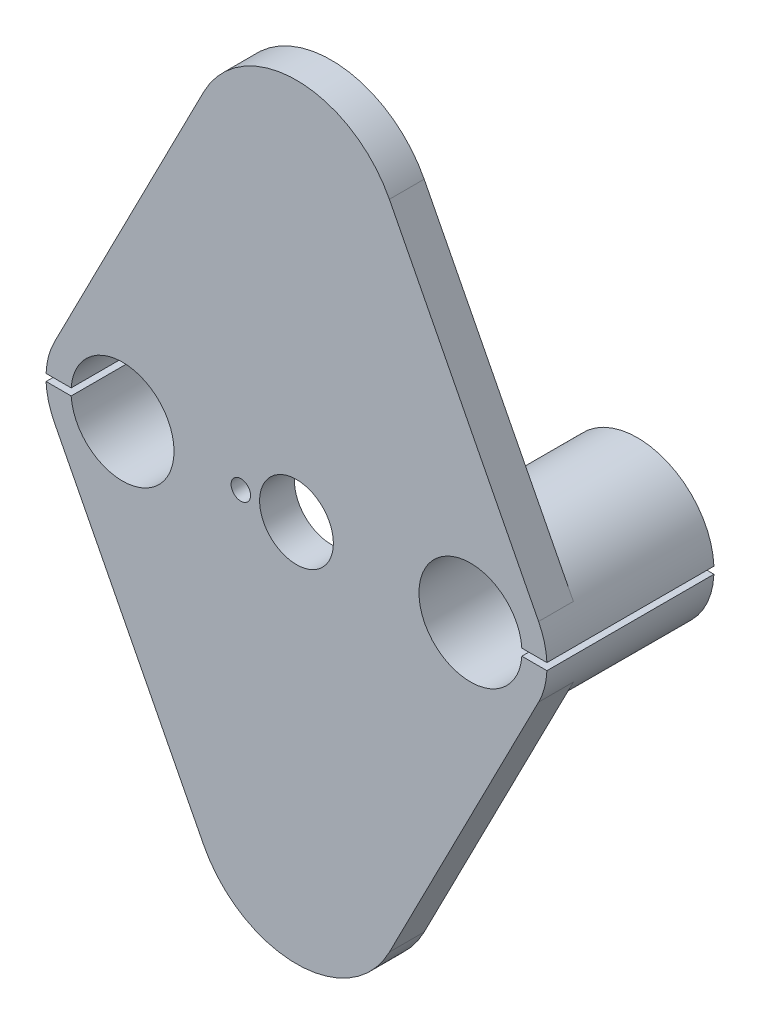
ISO-10303-21;
HEADER;
FILE_DESCRIPTION(('STEP AP214'),'2;1');
FILE_NAME('part.step','',(''),(''),'','','');
FILE_SCHEMA(('AUTOMOTIVE_DESIGN { 1 0 10303 214 1 1 1 1 }'));
ENDSEC;
DATA;
#1=APPLICATION_CONTEXT('core data for automotive mechanical design processes');
#2=APPLICATION_PROTOCOL_DEFINITION('international standard','automotive_design',2000,#1);
#3=PRODUCT_CONTEXT('',#1,'mechanical');
#4=PRODUCT('Part','Part','',(#3));
#5=PRODUCT_RELATED_PRODUCT_CATEGORY('part','',(#4));
#6=PRODUCT_DEFINITION_FORMATION('','',#4);
#7=PRODUCT_DEFINITION_CONTEXT('part definition',#1,'design');
#8=PRODUCT_DEFINITION('design','',#6,#7);
#9=PRODUCT_DEFINITION_SHAPE('','',#8);
#10=(LENGTH_UNIT() NAMED_UNIT(*) SI_UNIT(.MILLI.,.METRE.));
#11=(NAMED_UNIT(*) PLANE_ANGLE_UNIT() SI_UNIT($,.RADIAN.));
#12=(NAMED_UNIT(*) SI_UNIT($,.STERADIAN.) SOLID_ANGLE_UNIT());
#13=UNCERTAINTY_MEASURE_WITH_UNIT(LENGTH_MEASURE(1.E-05),#10,'distance_accuracy_value','');
#14=(GEOMETRIC_REPRESENTATION_CONTEXT(3) GLOBAL_UNCERTAINTY_ASSIGNED_CONTEXT((#13)) GLOBAL_UNIT_ASSIGNED_CONTEXT((#10,
#11,#12)) REPRESENTATION_CONTEXT('',''));
#15=CARTESIAN_POINT('',(0.,0.,0.));
#16=DIRECTION('',(0.,0.,1.));
#17=DIRECTION('',(1.,0.,0.));
#18=AXIS2_PLACEMENT_3D('',#15,#16,#17);
#19=CARTESIAN_POINT('',(0.,95.,5.));
#20=DIRECTION('',(0.,0.,1.));
#21=DIRECTION('',(1.,0.,0.));
#22=AXIS2_PLACEMENT_3D('',#19,#20,#21);
#23=PLANE('',#22);
#24=CARTESIAN_POINT('',(-7.99999999999999,55.,5.));
#25=DIRECTION('',(0.,0.,1.));
#26=DIRECTION('',(1.,0.,0.));
#27=AXIS2_PLACEMENT_3D('',#24,#25,#26);
#28=CIRCLE('',#27,1.4);
#29=CARTESIAN_POINT('',(-6.59999999999999,55.,5.));
#30=VERTEX_POINT('',#29);
#31=EDGE_CURVE('E379',#30,#30,#28,.T.);
#32=ORIENTED_EDGE('',*,*,#31,.F.);
#33=EDGE_LOOP('',(#32));
#34=FACE_BOUND('',#33,.T.);
#35=CARTESIAN_POINT('',(0.,55.,5.));
#36=DIRECTION('',(0.,0.,1.));
#37=DIRECTION('',(1.,0.,0.));
#38=AXIS2_PLACEMENT_3D('',#35,#36,#37);
#39=CIRCLE('',#38,5.3);
#40=CARTESIAN_POINT('',(5.30000000000001,55.,5.));
#41=VERTEX_POINT('',#40);
#42=EDGE_CURVE('E214',#41,#41,#39,.T.);
#43=ORIENTED_EDGE('',*,*,#42,.F.);
#44=EDGE_LOOP('',(#43));
#45=FACE_BOUND('',#44,.T.);
#46=CARTESIAN_POINT('',(-25.,55.,5.));
#47=DIRECTION('',(0.,0.,1.));
#48=DIRECTION('',(1.,0.,0.));
#49=AXIS2_PLACEMENT_3D('',#46,#47,#48);
#50=CIRCLE('',#49,7.4);
#51=CARTESIAN_POINT('',(-32.3830887845129,55.5,5.));
#52=VERTEX_POINT('',#51);
#53=CARTESIAN_POINT('',(-32.3830887845129,54.5,5.));
#54=VERTEX_POINT('',#53);
#55=EDGE_CURVE('E318',#52,#54,#50,.F.);
#56=ORIENTED_EDGE('',*,*,#55,.T.);
#57=DIRECTION('',(-1.,0.,0.));
#58=VECTOR('',#57,1.);
#59=CARTESIAN_POINT('',(35.9896304879179,54.5,5.));
#60=LINE('',#59,#58);
#61=CARTESIAN_POINT('',(-35.9886304879179,54.5,5.));
#62=VERTEX_POINT('',#61);
#63=EDGE_CURVE('E70',#54,#62,#60,.T.);
#64=ORIENTED_EDGE('',*,*,#63,.T.);
#65=CARTESIAN_POINT('',(-25.,55.,5.));
#66=DIRECTION('',(0.,0.,1.));
#67=DIRECTION('',(1.,0.,0.));
#68=AXIS2_PLACEMENT_3D('',#65,#66,#67);
#69=CIRCLE('',#68,11.);
#70=CARTESIAN_POINT('',(-34.7887640449438,49.9820224719101,5.));
#71=VERTEX_POINT('',#70);
#72=EDGE_CURVE('E186',#62,#71,#69,.T.);
#73=ORIENTED_EDGE('',*,*,#72,.T.);
#74=DIRECTION('',(0.456179775280899,-0.889887640449438,0.));
#75=VECTOR('',#74,1.);
#76=CARTESIAN_POINT('',(-34.7887640449438,49.9820224719101,5.));
#77=LINE('',#76,#75);
#78=CARTESIAN_POINT('',(-13.3483146067416,8.15730337078653,5.));
#79=VERTEX_POINT('',#78);
#80=EDGE_CURVE('E185',#71,#79,#77,.T.);
#81=ORIENTED_EDGE('',*,*,#80,.T.);
#82=CARTESIAN_POINT('',(0.,15.,5.));
#83=DIRECTION('',(0.,0.,1.));
#84=DIRECTION('',(-1.,0.,0.));
#85=AXIS2_PLACEMENT_3D('',#82,#83,#84);
#86=CIRCLE('',#85,15.);
#87=CARTESIAN_POINT('',(13.3483146067416,8.15730337078652,5.));
#88=VERTEX_POINT('',#87);
#89=EDGE_CURVE('E190',#79,#88,#86,.T.);
#90=ORIENTED_EDGE('',*,*,#89,.T.);
#91=DIRECTION('',(0.456179775280898,0.889887640449438,0.));
#92=VECTOR('',#91,1.);
#93=CARTESIAN_POINT('',(34.7887640449438,49.9820224719101,5.));
#94=LINE('',#93,#92);
#95=CARTESIAN_POINT('',(34.7887640449438,49.9820224719101,5.));
#96=VERTEX_POINT('',#95);
#97=EDGE_CURVE('E197',#88,#96,#94,.T.);
#98=ORIENTED_EDGE('',*,*,#97,.T.);
#99=CARTESIAN_POINT('',(25.,55.,5.));
#100=DIRECTION('',(0.,0.,1.));
#101=DIRECTION('',(-1.,0.,0.));
#102=AXIS2_PLACEMENT_3D('',#99,#100,#101);
#103=CIRCLE('',#102,11.);
#104=CARTESIAN_POINT('',(35.9886304879179,54.5,5.));
#105=VERTEX_POINT('',#104);
#106=EDGE_CURVE('E201',#96,#105,#103,.T.);
#107=ORIENTED_EDGE('',*,*,#106,.T.);
#108=DIRECTION('',(1.,0.,0.));
#109=VECTOR('',#108,1.);
#110=CARTESIAN_POINT('',(-36.001,54.5,5.));
#111=LINE('',#110,#109);
#112=CARTESIAN_POINT('',(32.3830887845129,54.5,5.));
#113=VERTEX_POINT('',#112);
#114=EDGE_CURVE('E343',#113,#105,#111,.T.);
#115=ORIENTED_EDGE('',*,*,#114,.F.);
#116=CARTESIAN_POINT('',(25.,55.,5.));
#117=DIRECTION('',(0.,0.,1.));
#118=DIRECTION('',(1.,0.,0.));
#119=AXIS2_PLACEMENT_3D('',#116,#117,#118);
#120=CIRCLE('',#119,7.4);
#121=CARTESIAN_POINT('',(32.3830887845129,55.5,5.));
#122=VERTEX_POINT('',#121);
#123=EDGE_CURVE('E358',#113,#122,#120,.F.);
#124=ORIENTED_EDGE('',*,*,#123,.T.);
#125=DIRECTION('',(1.,0.,0.));
#126=VECTOR('',#125,1.);
#127=CARTESIAN_POINT('',(-36.001,55.5,5.));
#128=LINE('',#127,#126);
#129=CARTESIAN_POINT('',(35.9886304879179,55.5,5.));
#130=VERTEX_POINT('',#129);
#131=EDGE_CURVE('E346',#122,#130,#128,.T.);
#132=ORIENTED_EDGE('',*,*,#131,.T.);
#133=CARTESIAN_POINT('',(34.7887640449438,60.0179775280899,5.));
#134=VERTEX_POINT('',#133);
#135=EDGE_CURVE('E200',#130,#134,#103,.T.);
#136=ORIENTED_EDGE('',*,*,#135,.T.);
#137=DIRECTION('',(-0.456179775280899,0.889887640449438,0.));
#138=VECTOR('',#137,1.);
#139=CARTESIAN_POINT('',(34.7887640449438,60.0179775280899,5.));
#140=LINE('',#139,#138);
#141=CARTESIAN_POINT('',(13.3483146067415,101.842696629213,5.));
#142=VERTEX_POINT('',#141);
#143=EDGE_CURVE('E205',#134,#142,#140,.T.);
#144=ORIENTED_EDGE('',*,*,#143,.T.);
#145=CARTESIAN_POINT('',(0.,95.,5.));
#146=DIRECTION('',(0.,0.,1.));
#147=DIRECTION('',(1.,0.,0.));
#148=AXIS2_PLACEMENT_3D('',#145,#146,#147);
#149=CIRCLE('',#148,15.);
#150=CARTESIAN_POINT('',(-13.3483146067416,101.842696629213,5.));
#151=VERTEX_POINT('',#150);
#152=EDGE_CURVE('E231',#142,#151,#149,.T.);
#153=ORIENTED_EDGE('',*,*,#152,.T.);
#154=DIRECTION('',(-0.456179775280899,-0.889887640449438,0.));
#155=VECTOR('',#154,1.);
#156=CARTESIAN_POINT('',(-34.7887640449438,60.0179775280899,5.));
#157=LINE('',#156,#155);
#158=CARTESIAN_POINT('',(-34.7887640449438,60.0179775280899,5.));
#159=VERTEX_POINT('',#158);
#160=EDGE_CURVE('E182',#151,#159,#157,.T.);
#161=ORIENTED_EDGE('',*,*,#160,.T.);
#162=CARTESIAN_POINT('',(-35.9886304879179,55.5,5.));
#163=VERTEX_POINT('',#162);
#164=EDGE_CURVE('E176',#159,#163,#69,.T.);
#165=ORIENTED_EDGE('',*,*,#164,.T.);
#166=DIRECTION('',(-1.,0.,0.));
#167=VECTOR('',#166,1.);
#168=CARTESIAN_POINT('',(35.9896304879179,55.5,5.));
#169=LINE('',#168,#167);
#170=EDGE_CURVE('E158',#52,#163,#169,.T.);
#171=ORIENTED_EDGE('',*,*,#170,.F.);
#172=EDGE_LOOP('',(#56,#64,#73,#81,#90,#98,#107,#115,#124,#132,#136,#144,#153,#161,#165,#171));
#173=FACE_BOUND('',#172,.T.);
#174=ADVANCED_FACE('F45',(#34,#45,#173),#23,.T.);
#175=CARTESIAN_POINT('',(-25.,55.,5.));
#176=DIRECTION('',(0.,0.,-1.));
#177=DIRECTION('',(-1.,0.,0.));
#178=AXIS2_PLACEMENT_3D('',#175,#176,#177);
#179=CYLINDRICAL_SURFACE('',#178,11.);
#180=DIRECTION('',(0.,0.,-1.));
#181=VECTOR('',#180,1.);
#182=CARTESIAN_POINT('',(-35.9886304879179,54.5,5.));
#183=LINE('',#182,#181);
#184=CARTESIAN_POINT('',(-35.9886304879179,54.5,-19.));
#185=VERTEX_POINT('',#184);
#186=EDGE_CURVE('E317',#62,#185,#183,.T.);
#187=ORIENTED_EDGE('',*,*,#186,.T.);
#188=CARTESIAN_POINT('',(-25.,55.,-19.));
#189=DIRECTION('',(0.,0.,-1.));
#190=DIRECTION('',(-1.,0.,0.));
#191=AXIS2_PLACEMENT_3D('',#188,#189,#190);
#192=CIRCLE('',#191,11.);
#193=CARTESIAN_POINT('',(-35.9886304879179,55.5,-19.));
#194=VERTEX_POINT('',#193);
#195=EDGE_CURVE('E178',#194,#185,#192,.T.);
#196=ORIENTED_EDGE('',*,*,#195,.F.);
#197=DIRECTION('',(0.,0.,-1.));
#198=VECTOR('',#197,1.);
#199=CARTESIAN_POINT('',(-35.9886304879179,55.5,5.));
#200=LINE('',#199,#198);
#201=EDGE_CURVE('E161',#194,#163,#200,.F.);
#202=ORIENTED_EDGE('',*,*,#201,.T.);
#203=ORIENTED_EDGE('',*,*,#164,.F.);
#204=DIRECTION('',(0.,0.,-1.));
#205=VECTOR('',#204,1.);
#206=CARTESIAN_POINT('',(-34.7887640449438,60.0179775280899,5.));
#207=LINE('',#206,#205);
#208=CARTESIAN_POINT('',(-34.7887640449438,60.0179775280899,0.));
#209=VERTEX_POINT('',#208);
#210=EDGE_CURVE('E254',#159,#209,#207,.T.);
#211=ORIENTED_EDGE('',*,*,#210,.T.);
#212=CARTESIAN_POINT('',(-25.,55.,0.));
#213=DIRECTION('',(0.,0.,-1.));
#214=DIRECTION('',(-1.,0.,0.));
#215=AXIS2_PLACEMENT_3D('',#212,#213,#214);
#216=CIRCLE('',#215,11.);
#217=CARTESIAN_POINT('',(-34.7887640449438,49.9820224719101,0.));
#218=VERTEX_POINT('',#217);
#219=EDGE_CURVE('E269',#209,#218,#216,.T.);
#220=ORIENTED_EDGE('',*,*,#219,.T.);
#221=DIRECTION('',(0.,0.,-1.));
#222=VECTOR('',#221,1.);
#223=CARTESIAN_POINT('',(-34.7887640449438,49.9820224719101,5.));
#224=LINE('',#223,#222);
#225=EDGE_CURVE('E251',#71,#218,#224,.T.);
#226=ORIENTED_EDGE('',*,*,#225,.F.);
#227=ORIENTED_EDGE('',*,*,#72,.F.);
#228=EDGE_LOOP('',(#187,#196,#202,#203,#211,#220,#226,#227));
#229=FACE_BOUND('',#228,.T.);
#230=ADVANCED_FACE('F174',(#229),#179,.T.);
#231=CARTESIAN_POINT('',(-25.,55.,-19.));
#232=DIRECTION('',(0.,0.,-1.));
#233=DIRECTION('',(-1.,0.,0.));
#234=AXIS2_PLACEMENT_3D('',#231,#232,#233);
#235=PLANE('',#234);
#236=ORIENTED_EDGE('',*,*,#195,.T.);
#237=DIRECTION('',(-1.,0.,0.));
#238=VECTOR('',#237,1.);
#239=CARTESIAN_POINT('',(35.9896304879179,54.5,-19.));
#240=LINE('',#239,#238);
#241=CARTESIAN_POINT('',(-32.3830887845129,54.5,-19.));
#242=VERTEX_POINT('',#241);
#243=EDGE_CURVE('E325',#242,#185,#240,.T.);
#244=ORIENTED_EDGE('',*,*,#243,.F.);
#245=CARTESIAN_POINT('',(-25.,55.,-19.));
#246=DIRECTION('',(0.,0.,-1.));
#247=DIRECTION('',(-1.,0.,0.));
#248=AXIS2_PLACEMENT_3D('',#245,#246,#247);
#249=CIRCLE('',#248,7.4);
#250=CARTESIAN_POINT('',(-32.3830887845129,55.5,-19.));
#251=VERTEX_POINT('',#250);
#252=EDGE_CURVE('E283',#251,#242,#249,.T.);
#253=ORIENTED_EDGE('',*,*,#252,.F.);
#254=DIRECTION('',(-1.,0.,0.));
#255=VECTOR('',#254,1.);
#256=CARTESIAN_POINT('',(35.9896304879179,55.5,-19.));
#257=LINE('',#256,#255);
#258=EDGE_CURVE('E62',#251,#194,#257,.T.);
#259=ORIENTED_EDGE('',*,*,#258,.T.);
#260=EDGE_LOOP('',(#236,#244,#253,#259));
#261=FACE_BOUND('',#260,.T.);
#262=ADVANCED_FACE('F369',(#261),#235,.T.);
#263=CARTESIAN_POINT('',(-25.,55.,5.001));
#264=DIRECTION('',(0.,0.,-1.));
#265=DIRECTION('',(-1.,0.,0.));
#266=AXIS2_PLACEMENT_3D('',#263,#264,#265);
#267=CYLINDRICAL_SURFACE('',#266,7.4);
#268=DIRECTION('',(0.,0.,-1.));
#269=VECTOR('',#268,1.);
#270=CARTESIAN_POINT('',(-32.3830887845129,54.5,5.001));
#271=LINE('',#270,#269);
#272=EDGE_CURVE('E322',#242,#54,#271,.F.);
#273=ORIENTED_EDGE('',*,*,#272,.T.);
#274=ORIENTED_EDGE('',*,*,#55,.F.);
#275=DIRECTION('',(0.,0.,-1.));
#276=VECTOR('',#275,1.);
#277=CARTESIAN_POINT('',(-32.3830887845129,55.5,5.001));
#278=LINE('',#277,#276);
#279=EDGE_CURVE('E162',#52,#251,#278,.T.);
#280=ORIENTED_EDGE('',*,*,#279,.T.);
#281=ORIENTED_EDGE('',*,*,#252,.T.);
#282=EDGE_LOOP('',(#273,#274,#280,#281));
#283=FACE_BOUND('',#282,.T.);
#284=ADVANCED_FACE('F366',(#283),#267,.F.);
#285=CARTESIAN_POINT('',(0.,95.,0.));
#286=DIRECTION('',(0.,0.,1.));
#287=DIRECTION('',(1.,0.,0.));
#288=AXIS2_PLACEMENT_3D('',#285,#286,#287);
#289=PLANE('',#288);
#290=CARTESIAN_POINT('',(-7.99999999999999,55.,0.));
#291=DIRECTION('',(0.,0.,1.));
#292=DIRECTION('',(1.,0.,0.));
#293=AXIS2_PLACEMENT_3D('',#290,#291,#292);
#294=CIRCLE('',#293,1.4);
#295=CARTESIAN_POINT('',(-6.59999999999999,55.,0.));
#296=VERTEX_POINT('',#295);
#297=EDGE_CURVE('E168',#296,#296,#294,.F.);
#298=ORIENTED_EDGE('',*,*,#297,.F.);
#299=EDGE_LOOP('',(#298));
#300=FACE_BOUND('',#299,.T.);
#301=ORIENTED_EDGE('',*,*,#219,.F.);
#302=DIRECTION('',(-0.456179775280899,-0.889887640449438,0.));
#303=VECTOR('',#302,1.);
#304=CARTESIAN_POINT('',(-34.7887640449438,60.0179775280899,0.));
#305=LINE('',#304,#303);
#306=CARTESIAN_POINT('',(-13.3483146067416,101.842696629213,0.));
#307=VERTEX_POINT('',#306);
#308=EDGE_CURVE('E213',#307,#209,#305,.T.);
#309=ORIENTED_EDGE('',*,*,#308,.F.);
#310=CARTESIAN_POINT('',(0.,95.,0.));
#311=DIRECTION('',(0.,0.,1.));
#312=DIRECTION('',(1.,0.,0.));
#313=AXIS2_PLACEMENT_3D('',#310,#311,#312);
#314=CIRCLE('',#313,15.);
#315=CARTESIAN_POINT('',(13.3483146067415,101.842696629213,0.));
#316=VERTEX_POINT('',#315);
#317=EDGE_CURVE('E209',#316,#307,#314,.T.);
#318=ORIENTED_EDGE('',*,*,#317,.F.);
#319=DIRECTION('',(-0.456179775280899,0.889887640449438,0.));
#320=VECTOR('',#319,1.);
#321=CARTESIAN_POINT('',(34.7887640449438,60.0179775280899,0.));
#322=LINE('',#321,#320);
#323=CARTESIAN_POINT('',(34.7887640449438,60.0179775280899,0.));
#324=VERTEX_POINT('',#323);
#325=EDGE_CURVE('E228',#324,#316,#322,.T.);
#326=ORIENTED_EDGE('',*,*,#325,.F.);
#327=CARTESIAN_POINT('',(25.,55.,0.));
#328=DIRECTION('',(0.,0.,-1.));
#329=DIRECTION('',(-1.,0.,0.));
#330=AXIS2_PLACEMENT_3D('',#327,#328,#329);
#331=CIRCLE('',#330,11.);
#332=CARTESIAN_POINT('',(34.7887640449438,49.9820224719101,0.));
#333=VERTEX_POINT('',#332);
#334=EDGE_CURVE('E11',#333,#324,#331,.T.);
#335=ORIENTED_EDGE('',*,*,#334,.F.);
#336=DIRECTION('',(0.456179775280898,0.889887640449438,0.));
#337=VECTOR('',#336,1.);
#338=CARTESIAN_POINT('',(34.7887640449438,49.9820224719101,0.));
#339=LINE('',#338,#337);
#340=CARTESIAN_POINT('',(13.3483146067416,8.15730337078652,0.));
#341=VERTEX_POINT('',#340);
#342=EDGE_CURVE('E224',#341,#333,#339,.T.);
#343=ORIENTED_EDGE('',*,*,#342,.F.);
#344=CARTESIAN_POINT('',(0.,15.,0.));
#345=DIRECTION('',(0.,0.,1.));
#346=DIRECTION('',(-1.,0.,0.));
#347=AXIS2_PLACEMENT_3D('',#344,#345,#346);
#348=CIRCLE('',#347,15.);
#349=CARTESIAN_POINT('',(-13.3483146067416,8.15730337078653,0.));
#350=VERTEX_POINT('',#349);
#351=EDGE_CURVE('E221',#350,#341,#348,.T.);
#352=ORIENTED_EDGE('',*,*,#351,.F.);
#353=DIRECTION('',(0.456179775280899,-0.889887640449438,0.));
#354=VECTOR('',#353,1.);
#355=CARTESIAN_POINT('',(-34.7887640449438,49.9820224719101,0.));
#356=LINE('',#355,#354);
#357=EDGE_CURVE('E218',#218,#350,#356,.T.);
#358=ORIENTED_EDGE('',*,*,#357,.F.);
#359=EDGE_LOOP('',(#301,#309,#318,#326,#335,#343,#352,#358));
#360=FACE_BOUND('',#359,.T.);
#361=CARTESIAN_POINT('',(0.,55.,0.));
#362=DIRECTION('',(0.,0.,1.));
#363=DIRECTION('',(1.,0.,0.));
#364=AXIS2_PLACEMENT_3D('',#361,#362,#363);
#365=CIRCLE('',#364,5.3);
#366=CARTESIAN_POINT('',(5.30000000000001,55.,0.));
#367=VERTEX_POINT('',#366);
#368=EDGE_CURVE('E278',#367,#367,#365,.T.);
#369=ORIENTED_EDGE('',*,*,#368,.T.);
#370=EDGE_LOOP('',(#369));
#371=FACE_BOUND('',#370,.T.);
#372=ADVANCED_FACE('F266',(#300,#360,#371),#289,.F.);
#373=CARTESIAN_POINT('',(0.,95.,5.));
#374=DIRECTION('',(0.,0.,-1.));
#375=DIRECTION('',(-1.,0.,0.));
#376=AXIS2_PLACEMENT_3D('',#373,#374,#375);
#377=CYLINDRICAL_SURFACE('',#376,15.);
#378=ORIENTED_EDGE('',*,*,#317,.T.);
#379=DIRECTION('',(0.,0.,-1.));
#380=VECTOR('',#379,1.);
#381=CARTESIAN_POINT('',(-13.3483146067416,101.842696629213,5.));
#382=LINE('',#381,#380);
#383=EDGE_CURVE('E49',#151,#307,#382,.T.);
#384=ORIENTED_EDGE('',*,*,#383,.F.);
#385=ORIENTED_EDGE('',*,*,#152,.F.);
#386=DIRECTION('',(0.,0.,-1.));
#387=VECTOR('',#386,1.);
#388=CARTESIAN_POINT('',(13.3483146067415,101.842696629213,5.));
#389=LINE('',#388,#387);
#390=EDGE_CURVE('E208',#142,#316,#389,.T.);
#391=ORIENTED_EDGE('',*,*,#390,.T.);
#392=EDGE_LOOP('',(#378,#384,#385,#391));
#393=FACE_BOUND('',#392,.T.);
#394=ADVANCED_FACE('F47',(#393),#377,.T.);
#395=CARTESIAN_POINT('',(-34.7887640449438,60.0179775280899,5.));
#396=DIRECTION('',(0.889887640449438,-0.456179775280899,0.));
#397=DIRECTION('',(0.456179775280899,0.889887640449438,0.));
#398=AXIS2_PLACEMENT_3D('',#395,#396,#397);
#399=PLANE('',#398);
#400=ORIENTED_EDGE('',*,*,#308,.T.);
#401=ORIENTED_EDGE('',*,*,#210,.F.);
#402=ORIENTED_EDGE('',*,*,#160,.F.);
#403=ORIENTED_EDGE('',*,*,#383,.T.);
#404=EDGE_LOOP('',(#400,#401,#402,#403));
#405=FACE_BOUND('',#404,.T.);
#406=ADVANCED_FACE('F260',(#405),#399,.F.);
#407=CARTESIAN_POINT('',(-34.7887640449438,49.9820224719101,5.));
#408=DIRECTION('',(0.889887640449438,0.456179775280899,0.));
#409=DIRECTION('',(-0.456179775280899,0.889887640449438,0.));
#410=AXIS2_PLACEMENT_3D('',#407,#408,#409);
#411=PLANE('',#410);
#412=ORIENTED_EDGE('',*,*,#357,.T.);
#413=DIRECTION('',(0.,0.,-1.));
#414=VECTOR('',#413,1.);
#415=CARTESIAN_POINT('',(-13.3483146067416,8.15730337078653,5.));
#416=LINE('',#415,#414);
#417=EDGE_CURVE('E247',#79,#350,#416,.T.);
#418=ORIENTED_EDGE('',*,*,#417,.F.);
#419=ORIENTED_EDGE('',*,*,#80,.F.);
#420=ORIENTED_EDGE('',*,*,#225,.T.);
#421=EDGE_LOOP('',(#412,#418,#419,#420));
#422=FACE_BOUND('',#421,.T.);
#423=ADVANCED_FACE('F315',(#422),#411,.F.);
#424=CARTESIAN_POINT('',(0.,15.,5.));
#425=DIRECTION('',(0.,0.,-1.));
#426=DIRECTION('',(-1.,0.,0.));
#427=AXIS2_PLACEMENT_3D('',#424,#425,#426);
#428=CYLINDRICAL_SURFACE('',#427,15.);
#429=ORIENTED_EDGE('',*,*,#351,.T.);
#430=DIRECTION('',(0.,0.,-1.));
#431=VECTOR('',#430,1.);
#432=CARTESIAN_POINT('',(13.3483146067416,8.15730337078652,5.));
#433=LINE('',#432,#431);
#434=EDGE_CURVE('E243',#88,#341,#433,.T.);
#435=ORIENTED_EDGE('',*,*,#434,.F.);
#436=ORIENTED_EDGE('',*,*,#89,.F.);
#437=ORIENTED_EDGE('',*,*,#417,.T.);
#438=EDGE_LOOP('',(#429,#435,#436,#437));
#439=FACE_BOUND('',#438,.T.);
#440=ADVANCED_FACE('F311',(#439),#428,.T.);
#441=CARTESIAN_POINT('',(34.7887640449438,49.9820224719101,5.));
#442=DIRECTION('',(-0.889887640449438,0.456179775280898,0.));
#443=DIRECTION('',(-0.456179775280898,-0.889887640449438,0.));
#444=AXIS2_PLACEMENT_3D('',#441,#442,#443);
#445=PLANE('',#444);
#446=ORIENTED_EDGE('',*,*,#342,.T.);
#447=DIRECTION('',(0.,0.,-1.));
#448=VECTOR('',#447,1.);
#449=CARTESIAN_POINT('',(34.7887640449438,49.9820224719101,5.));
#450=LINE('',#449,#448);
#451=EDGE_CURVE('E239',#96,#333,#450,.T.);
#452=ORIENTED_EDGE('',*,*,#451,.F.);
#453=ORIENTED_EDGE('',*,*,#97,.F.);
#454=ORIENTED_EDGE('',*,*,#434,.T.);
#455=EDGE_LOOP('',(#446,#452,#453,#454));
#456=FACE_BOUND('',#455,.T.);
#457=ADVANCED_FACE('F306',(#456),#445,.F.);
#458=CARTESIAN_POINT('',(25.,55.,5.));
#459=DIRECTION('',(0.,0.,-1.));
#460=DIRECTION('',(-1.,0.,0.));
#461=AXIS2_PLACEMENT_3D('',#458,#459,#460);
#462=CYLINDRICAL_SURFACE('',#461,11.);
#463=CARTESIAN_POINT('',(25.,55.,-19.));
#464=DIRECTION('',(0.,0.,-1.));
#465=DIRECTION('',(-1.,0.,0.));
#466=AXIS2_PLACEMENT_3D('',#463,#464,#465);
#467=CIRCLE('',#466,11.);
#468=CARTESIAN_POINT('',(35.9886304879179,54.5,-19.));
#469=VERTEX_POINT('',#468);
#470=CARTESIAN_POINT('',(35.9886304879179,55.5,-19.));
#471=VERTEX_POINT('',#470);
#472=EDGE_CURVE('E273',#469,#471,#467,.T.);
#473=ORIENTED_EDGE('',*,*,#472,.F.);
#474=DIRECTION('',(0.,0.,-1.));
#475=VECTOR('',#474,1.);
#476=CARTESIAN_POINT('',(35.9886304879179,54.5,5.));
#477=LINE('',#476,#475);
#478=EDGE_CURVE('E340',#105,#469,#477,.T.);
#479=ORIENTED_EDGE('',*,*,#478,.F.);
#480=ORIENTED_EDGE('',*,*,#106,.F.);
#481=ORIENTED_EDGE('',*,*,#451,.T.);
#482=ORIENTED_EDGE('',*,*,#334,.T.);
#483=DIRECTION('',(0.,0.,-1.));
#484=VECTOR('',#483,1.);
#485=CARTESIAN_POINT('',(34.7887640449438,60.0179775280899,5.));
#486=LINE('',#485,#484);
#487=EDGE_CURVE('E235',#134,#324,#486,.T.);
#488=ORIENTED_EDGE('',*,*,#487,.F.);
#489=ORIENTED_EDGE('',*,*,#135,.F.);
#490=DIRECTION('',(0.,0.,-1.));
#491=VECTOR('',#490,1.);
#492=CARTESIAN_POINT('',(35.9886304879179,55.5,5.));
#493=LINE('',#492,#491);
#494=EDGE_CURVE('E337',#471,#130,#493,.F.);
#495=ORIENTED_EDGE('',*,*,#494,.F.);
#496=EDGE_LOOP('',(#473,#479,#480,#481,#482,#488,#489,#495));
#497=FACE_BOUND('',#496,.T.);
#498=ADVANCED_FACE('F301',(#497),#462,.T.);
#499=CARTESIAN_POINT('',(34.7887640449438,60.0179775280899,5.));
#500=DIRECTION('',(-0.889887640449438,-0.456179775280899,0.));
#501=DIRECTION('',(0.456179775280899,-0.889887640449438,0.));
#502=AXIS2_PLACEMENT_3D('',#499,#500,#501);
#503=PLANE('',#502);
#504=ORIENTED_EDGE('',*,*,#325,.T.);
#505=ORIENTED_EDGE('',*,*,#390,.F.);
#506=ORIENTED_EDGE('',*,*,#143,.F.);
#507=ORIENTED_EDGE('',*,*,#487,.T.);
#508=EDGE_LOOP('',(#504,#505,#506,#507));
#509=FACE_BOUND('',#508,.T.);
#510=ADVANCED_FACE('F298',(#509),#503,.F.);
#511=CARTESIAN_POINT('',(0.,55.,5.));
#512=DIRECTION('',(0.,0.,-1.));
#513=DIRECTION('',(-1.,0.,0.));
#514=AXIS2_PLACEMENT_3D('',#511,#512,#513);
#515=CYLINDRICAL_SURFACE('',#514,5.3);
#516=ORIENTED_EDGE('',*,*,#42,.T.);
#517=EDGE_LOOP('',(#516));
#518=FACE_BOUND('',#517,.T.);
#519=ORIENTED_EDGE('',*,*,#368,.F.);
#520=EDGE_LOOP('',(#519));
#521=FACE_BOUND('',#520,.T.);
#522=ADVANCED_FACE('F392',(#518,#521),#515,.F.);
#523=CARTESIAN_POINT('',(25.,55.,-19.));
#524=DIRECTION('',(0.,0.,-1.));
#525=DIRECTION('',(-1.,0.,0.));
#526=AXIS2_PLACEMENT_3D('',#523,#524,#525);
#527=PLANE('',#526);
#528=DIRECTION('',(1.,0.,0.));
#529=VECTOR('',#528,1.);
#530=CARTESIAN_POINT('',(-36.001,54.5,-19.));
#531=LINE('',#530,#529);
#532=CARTESIAN_POINT('',(32.3830887845129,54.5,-19.));
#533=VERTEX_POINT('',#532);
#534=EDGE_CURVE('E333',#533,#469,#531,.T.);
#535=ORIENTED_EDGE('',*,*,#534,.T.);
#536=ORIENTED_EDGE('',*,*,#472,.T.);
#537=DIRECTION('',(1.,0.,0.));
#538=VECTOR('',#537,1.);
#539=CARTESIAN_POINT('',(-36.001,55.5,-19.));
#540=LINE('',#539,#538);
#541=CARTESIAN_POINT('',(32.3830887845129,55.5,-19.));
#542=VERTEX_POINT('',#541);
#543=EDGE_CURVE('E349',#542,#471,#540,.T.);
#544=ORIENTED_EDGE('',*,*,#543,.F.);
#545=CARTESIAN_POINT('',(25.,55.,-19.));
#546=DIRECTION('',(0.,0.,-1.));
#547=DIRECTION('',(-1.,0.,0.));
#548=AXIS2_PLACEMENT_3D('',#545,#546,#547);
#549=CIRCLE('',#548,7.4);
#550=EDGE_CURVE('E280',#533,#542,#549,.T.);
#551=ORIENTED_EDGE('',*,*,#550,.F.);
#552=EDGE_LOOP('',(#535,#536,#544,#551));
#553=FACE_BOUND('',#552,.T.);
#554=ADVANCED_FACE('F395',(#553),#527,.T.);
#555=CARTESIAN_POINT('',(25.,55.,5.001));
#556=DIRECTION('',(0.,0.,-1.));
#557=DIRECTION('',(-1.,0.,0.));
#558=AXIS2_PLACEMENT_3D('',#555,#556,#557);
#559=CYLINDRICAL_SURFACE('',#558,7.4);
#560=ORIENTED_EDGE('',*,*,#123,.F.);
#561=DIRECTION('',(0.,0.,-1.));
#562=VECTOR('',#561,1.);
#563=CARTESIAN_POINT('',(32.3830887845129,54.5,5.001));
#564=LINE('',#563,#562);
#565=EDGE_CURVE('E330',#533,#113,#564,.F.);
#566=ORIENTED_EDGE('',*,*,#565,.F.);
#567=ORIENTED_EDGE('',*,*,#550,.T.);
#568=DIRECTION('',(0.,0.,-1.));
#569=VECTOR('',#568,1.);
#570=CARTESIAN_POINT('',(32.3830887845129,55.5,5.001));
#571=LINE('',#570,#569);
#572=EDGE_CURVE('E334',#122,#542,#571,.T.);
#573=ORIENTED_EDGE('',*,*,#572,.F.);
#574=EDGE_LOOP('',(#560,#566,#567,#573));
#575=FACE_BOUND('',#574,.T.);
#576=ADVANCED_FACE('F449',(#575),#559,.F.);
#577=CARTESIAN_POINT('',(-36.001,55.5,5.));
#578=DIRECTION('',(0.,1.,0.));
#579=DIRECTION('',(0.,0.,1.));
#580=AXIS2_PLACEMENT_3D('',#577,#578,#579);
#581=PLANE('',#580);
#582=ORIENTED_EDGE('',*,*,#494,.T.);
#583=ORIENTED_EDGE('',*,*,#131,.F.);
#584=ORIENTED_EDGE('',*,*,#572,.T.);
#585=ORIENTED_EDGE('',*,*,#543,.T.);
#586=EDGE_LOOP('',(#582,#583,#584,#585));
#587=FACE_BOUND('',#586,.T.);
#588=ADVANCED_FACE('F458',(#587),#581,.F.);
#589=CARTESIAN_POINT('',(-36.001,54.5,5.));
#590=DIRECTION('',(0.,-1.,0.));
#591=DIRECTION('',(0.,0.,-1.));
#592=AXIS2_PLACEMENT_3D('',#589,#590,#591);
#593=PLANE('',#592);
#594=ORIENTED_EDGE('',*,*,#478,.T.);
#595=ORIENTED_EDGE('',*,*,#534,.F.);
#596=ORIENTED_EDGE('',*,*,#565,.T.);
#597=ORIENTED_EDGE('',*,*,#114,.T.);
#598=EDGE_LOOP('',(#594,#595,#596,#597));
#599=FACE_BOUND('',#598,.T.);
#600=ADVANCED_FACE('F467',(#599),#593,.F.);
#601=CARTESIAN_POINT('',(35.9896304879179,55.5,5.));
#602=DIRECTION('',(0.,-1.,0.));
#603=DIRECTION('',(0.,0.,-1.));
#604=AXIS2_PLACEMENT_3D('',#601,#602,#603);
#605=PLANE('',#604);
#606=ORIENTED_EDGE('',*,*,#258,.F.);
#607=ORIENTED_EDGE('',*,*,#279,.F.);
#608=ORIENTED_EDGE('',*,*,#170,.T.);
#609=ORIENTED_EDGE('',*,*,#201,.F.);
#610=EDGE_LOOP('',(#606,#607,#608,#609));
#611=FACE_BOUND('',#610,.T.);
#612=ADVANCED_FACE('F160',(#611),#605,.T.);
#613=CARTESIAN_POINT('',(35.9896304879179,54.5,5.));
#614=DIRECTION('',(0.,1.,0.));
#615=DIRECTION('',(0.,0.,1.));
#616=AXIS2_PLACEMENT_3D('',#613,#614,#615);
#617=PLANE('',#616);
#618=ORIENTED_EDGE('',*,*,#63,.F.);
#619=ORIENTED_EDGE('',*,*,#272,.F.);
#620=ORIENTED_EDGE('',*,*,#243,.T.);
#621=ORIENTED_EDGE('',*,*,#186,.F.);
#622=EDGE_LOOP('',(#618,#619,#620,#621));
#623=FACE_BOUND('',#622,.T.);
#624=ADVANCED_FACE('F370',(#623),#617,.T.);
#625=CARTESIAN_POINT('',(-7.99999999999999,55.,-19.001));
#626=DIRECTION('',(0.,0.,1.));
#627=DIRECTION('',(1.,0.,0.));
#628=AXIS2_PLACEMENT_3D('',#625,#626,#627);
#629=CYLINDRICAL_SURFACE('',#628,1.4);
#630=CARTESIAN_POINT('',(-6.59999999999999,55.,5.));
#631=CARTESIAN_POINT('',(-6.59999999999999,55.,4.94791666666666));
#632=CARTESIAN_POINT('',(-6.59999999999999,55.,4.89583333333333));
#633=CARTESIAN_POINT('',(-6.59999999999999,55.,4.79166666666666));
#634=CARTESIAN_POINT('',(-6.59999999999999,55.,4.73958333333333));
#635=CARTESIAN_POINT('',(-6.59999999999999,55.,4.63541666666666));
#636=CARTESIAN_POINT('',(-6.59999999999999,55.,4.58333333333333));
#637=CARTESIAN_POINT('',(-6.59999999999999,55.,4.47916666666666));
#638=CARTESIAN_POINT('',(-6.59999999999999,55.,4.42708333333333));
#639=CARTESIAN_POINT('',(-6.59999999999999,55.,4.32291666666666));
#640=CARTESIAN_POINT('',(-6.59999999999999,55.,4.27083333333333));
#641=CARTESIAN_POINT('',(-6.59999999999999,55.,4.16666666666666));
#642=CARTESIAN_POINT('',(-6.59999999999999,55.,4.11458333333333));
#643=CARTESIAN_POINT('',(-6.59999999999999,55.,4.01041666666666));
#644=CARTESIAN_POINT('',(-6.59999999999999,55.,3.95833333333333));
#645=CARTESIAN_POINT('',(-6.59999999999999,55.,3.85416666666666));
#646=CARTESIAN_POINT('',(-6.59999999999999,55.,3.80208333333333));
#647=CARTESIAN_POINT('',(-6.59999999999999,55.,3.69791666666666));
#648=CARTESIAN_POINT('',(-6.59999999999999,55.,3.64583333333333));
#649=CARTESIAN_POINT('',(-6.59999999999999,55.,3.54166666666667));
#650=CARTESIAN_POINT('',(-6.59999999999999,55.,3.48958333333333));
#651=CARTESIAN_POINT('',(-6.59999999999999,55.,3.38541666666667));
#652=CARTESIAN_POINT('',(-6.59999999999999,55.,3.33333333333333));
#653=CARTESIAN_POINT('',(-6.59999999999999,55.,3.22916666666667));
#654=CARTESIAN_POINT('',(-6.59999999999999,55.,3.17708333333333));
#655=CARTESIAN_POINT('',(-6.59999999999999,55.,3.07291666666667));
#656=CARTESIAN_POINT('',(-6.59999999999999,55.,3.02083333333333));
#657=CARTESIAN_POINT('',(-6.59999999999999,55.,2.91666666666667));
#658=CARTESIAN_POINT('',(-6.59999999999999,55.,2.86458333333333));
#659=CARTESIAN_POINT('',(-6.59999999999999,55.,2.76041666666667));
#660=CARTESIAN_POINT('',(-6.59999999999999,55.,2.70833333333333));
#661=CARTESIAN_POINT('',(-6.59999999999999,55.,2.60416666666667));
#662=CARTESIAN_POINT('',(-6.59999999999999,55.,2.55208333333333));
#663=CARTESIAN_POINT('',(-6.59999999999999,55.,2.44791666666667));
#664=CARTESIAN_POINT('',(-6.59999999999999,55.,2.39583333333333));
#665=CARTESIAN_POINT('',(-6.59999999999999,55.,2.29166666666667));
#666=CARTESIAN_POINT('',(-6.59999999999999,55.,2.23958333333333));
#667=CARTESIAN_POINT('',(-6.59999999999999,55.,2.13541666666667));
#668=CARTESIAN_POINT('',(-6.59999999999999,55.,2.08333333333333));
#669=CARTESIAN_POINT('',(-6.59999999999999,55.,1.97916666666667));
#670=CARTESIAN_POINT('',(-6.59999999999999,55.,1.92708333333333));
#671=CARTESIAN_POINT('',(-6.59999999999999,55.,1.82291666666666));
#672=CARTESIAN_POINT('',(-6.59999999999999,55.,1.77083333333333));
#673=CARTESIAN_POINT('',(-6.59999999999999,55.,1.66666666666666));
#674=CARTESIAN_POINT('',(-6.59999999999999,55.,1.61458333333333));
#675=CARTESIAN_POINT('',(-6.59999999999999,55.,1.51041666666666));
#676=CARTESIAN_POINT('',(-6.59999999999999,55.,1.45833333333333));
#677=CARTESIAN_POINT('',(-6.59999999999999,55.,1.35416666666667));
#678=CARTESIAN_POINT('',(-6.59999999999999,55.,1.30208333333333));
#679=CARTESIAN_POINT('',(-6.59999999999999,55.,1.19791666666667));
#680=CARTESIAN_POINT('',(-6.59999999999999,55.,1.14583333333333));
#681=CARTESIAN_POINT('',(-6.59999999999999,55.,1.04166666666667));
#682=CARTESIAN_POINT('',(-6.59999999999999,55.,0.989583333333333));
#683=CARTESIAN_POINT('',(-6.59999999999999,55.,0.885416666666668));
#684=CARTESIAN_POINT('',(-6.59999999999999,55.,0.833333333333334));
#685=CARTESIAN_POINT('',(-6.59999999999999,55.,0.729166666666667));
#686=CARTESIAN_POINT('',(-6.59999999999999,55.,0.677083333333334));
#687=CARTESIAN_POINT('',(-6.59999999999999,55.,0.572916666666667));
#688=CARTESIAN_POINT('',(-6.59999999999999,55.,0.520833333333334));
#689=CARTESIAN_POINT('',(-6.59999999999999,55.,0.416666666666667));
#690=CARTESIAN_POINT('',(-6.59999999999999,55.,0.364583333333334));
#691=CARTESIAN_POINT('',(-6.59999999999999,55.,0.260416666666667));
#692=CARTESIAN_POINT('',(-6.59999999999999,55.,0.208333333333333));
#693=CARTESIAN_POINT('',(-6.59999999999999,55.,0.104166666666667));
#694=CARTESIAN_POINT('',(-6.59999999999999,55.,0.0520833333333334));
#695=CARTESIAN_POINT('',(-6.59999999999999,55.,0.));
#696=B_SPLINE_CURVE_WITH_KNOTS('',3,(#630,#631,#632,#633,#634,#635,#636,#637,#638,#639,#640,
#641,#642,#643,#644,#645,#646,#647,#648,#649,#650,#651,#652,#653,#654,#655,#656,#657,#658,#659,
#660,#661,#662,#663,#664,#665,#666,#667,#668,#669,#670,#671,#672,#673,#674,#675,#676,#677,#678,
#679,#680,#681,#682,#683,#684,#685,#686,#687,#688,#689,#690,#691,#692,#693,#694,#695),
.UNSPECIFIED.,.F.,.F.,(4,2,2,2,2,2,2,2,2,2,2,2,2,2,2,2,2,2,2,2,2,2,2,2,2,2,2,2,2,2,2,2,4),(0.,
0.15625,0.3125,0.46875,0.625000000000001,0.781250000000001,0.937500000000001,1.09375,1.25,
1.40625,1.5625,1.71875,1.875,2.03125,2.1875,2.34375,2.5,2.65625,2.8125,2.96875,3.125,3.28125,
3.4375,3.59375,3.75,3.90625,4.0625,4.21875,4.375,4.53125,4.6875,4.84375,5.),.UNSPECIFIED.);
#697=EDGE_CURVE('BSEAM384',#30,#296,#696,.T.);
#698=ORIENTED_EDGE('',*,*,#31,.T.);
#699=ORIENTED_EDGE('',*,*,#297,.T.);
#700=ORIENTED_EDGE('',*,*,#697,.T.);
#701=ORIENTED_EDGE('',*,*,#697,.F.);
#702=EDGE_LOOP('',(#698,#700,#699,#701));
#703=FACE_BOUND('',#702,.T.);
#704=ADVANCED_FACE('F384',(#703),#629,.F.);
#705=CLOSED_SHELL('',(#174,#230,#262,#284,#372,#394,#406,#423,#440,#457,#498,#510,#522,#554,
#576,#588,#600,#612,#624,#704));
#706=MANIFOLD_SOLID_BREP('B2',#705);
#707=ADVANCED_BREP_SHAPE_REPRESENTATION('',(#18,#706),#14);
#708=SHAPE_DEFINITION_REPRESENTATION(#9,#707);
ENDSEC;
END-ISO-10303-21;
